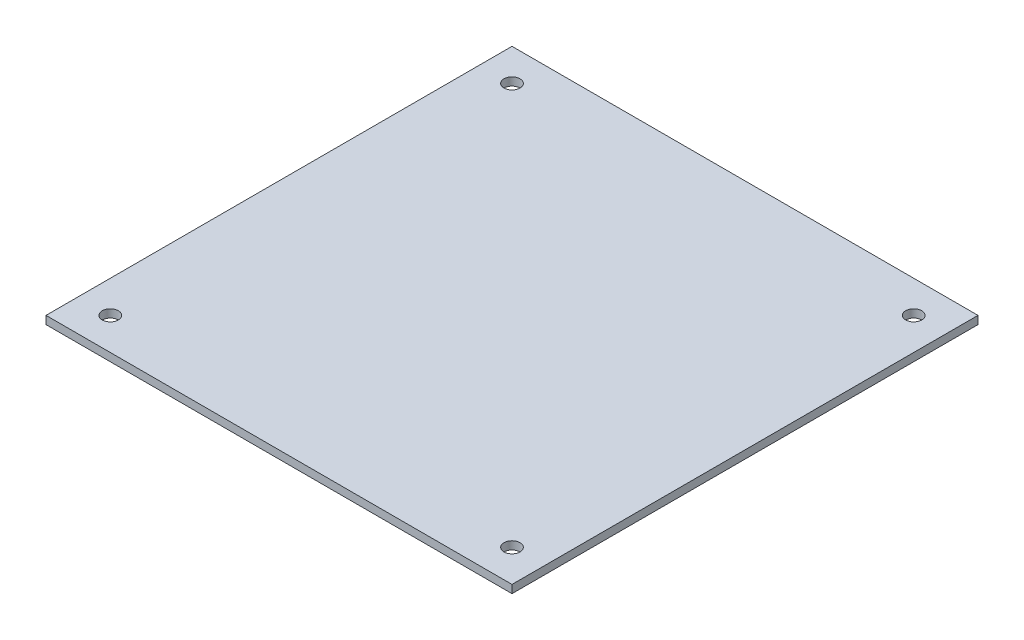
ISO-10303-21;
HEADER;
FILE_DESCRIPTION(('STEP AP214'),'2;1');
FILE_NAME('part.step','',(''),(''),'','','');
FILE_SCHEMA(('AUTOMOTIVE_DESIGN { 1 0 10303 214 1 1 1 1 }'));
ENDSEC;
DATA;
#1=APPLICATION_CONTEXT('core data for automotive mechanical design processes');
#2=APPLICATION_PROTOCOL_DEFINITION('international standard','automotive_design',2000,#1);
#3=PRODUCT_CONTEXT('',#1,'mechanical');
#4=PRODUCT('Part','Part','',(#3));
#5=PRODUCT_RELATED_PRODUCT_CATEGORY('part','',(#4));
#6=PRODUCT_DEFINITION_FORMATION('','',#4);
#7=PRODUCT_DEFINITION_CONTEXT('part definition',#1,'design');
#8=PRODUCT_DEFINITION('design','',#6,#7);
#9=PRODUCT_DEFINITION_SHAPE('','',#8);
#10=(LENGTH_UNIT() NAMED_UNIT(*) SI_UNIT(.MILLI.,.METRE.));
#11=(NAMED_UNIT(*) PLANE_ANGLE_UNIT() SI_UNIT($,.RADIAN.));
#12=(NAMED_UNIT(*) SI_UNIT($,.STERADIAN.) SOLID_ANGLE_UNIT());
#13=UNCERTAINTY_MEASURE_WITH_UNIT(LENGTH_MEASURE(1.E-05),#10,'distance_accuracy_value','');
#14=(GEOMETRIC_REPRESENTATION_CONTEXT(3) GLOBAL_UNCERTAINTY_ASSIGNED_CONTEXT((#13)) GLOBAL_UNIT_ASSIGNED_CONTEXT((#10,
#11,#12)) REPRESENTATION_CONTEXT('',''));
#15=CARTESIAN_POINT('',(0.,0.,0.));
#16=DIRECTION('',(0.,0.,1.));
#17=DIRECTION('',(1.,0.,0.));
#18=AXIS2_PLACEMENT_3D('',#15,#16,#17);
#19=CARTESIAN_POINT('',(0.,2.5,0.));
#20=DIRECTION('',(0.,1.,0.));
#21=DIRECTION('',(0.,0.,1.));
#22=AXIS2_PLACEMENT_3D('',#19,#20,#21);
#23=PLANE('',#22);
#24=CARTESIAN_POINT('',(62.5000000000034,2.5,62.4999999999966));
#25=DIRECTION('',(0.,1.,0.));
#26=DIRECTION('',(0.,0.,1.));
#27=AXIS2_PLACEMENT_3D('',#24,#25,#26);
#28=CIRCLE('',#27,2.49999999999822);
#29=CARTESIAN_POINT('',(62.5000000000034,2.5,64.9999999999948));
#30=VERTEX_POINT('',#29);
#31=EDGE_CURVE('E122',#30,#30,#28,.T.);
#32=ORIENTED_EDGE('',*,*,#31,.F.);
#33=EDGE_LOOP('',(#32));
#34=FACE_BOUND('',#33,.T.);
#35=CARTESIAN_POINT('',(-62.5,2.5,-62.5));
#36=DIRECTION('',(0.,1.,0.));
#37=DIRECTION('',(0.,0.,1.));
#38=AXIS2_PLACEMENT_3D('',#35,#36,#37);
#39=CIRCLE('',#38,2.49999999999822);
#40=CARTESIAN_POINT('',(-62.5,2.5,-60.0000000000018));
#41=VERTEX_POINT('',#40);
#42=EDGE_CURVE('E101',#41,#41,#39,.T.);
#43=ORIENTED_EDGE('',*,*,#42,.F.);
#44=EDGE_LOOP('',(#43));
#45=FACE_BOUND('',#44,.T.);
#46=DIRECTION('',(0.,0.,1.));
#47=VECTOR('',#46,1.);
#48=CARTESIAN_POINT('',(-72.5,2.5,-72.5));
#49=LINE('',#48,#47);
#50=CARTESIAN_POINT('',(-72.5,2.5,-72.5));
#51=VERTEX_POINT('',#50);
#52=CARTESIAN_POINT('',(-72.5,2.5,72.5));
#53=VERTEX_POINT('',#52);
#54=EDGE_CURVE('E86',#51,#53,#49,.T.);
#55=ORIENTED_EDGE('',*,*,#54,.T.);
#56=DIRECTION('',(1.,0.,0.));
#57=VECTOR('',#56,1.);
#58=CARTESIAN_POINT('',(-72.5,2.5,72.5));
#59=LINE('',#58,#57);
#60=CARTESIAN_POINT('',(72.5,2.5,72.5));
#61=VERTEX_POINT('',#60);
#62=EDGE_CURVE('E81',#53,#61,#59,.T.);
#63=ORIENTED_EDGE('',*,*,#62,.T.);
#64=DIRECTION('',(0.,0.,-1.));
#65=VECTOR('',#64,1.);
#66=CARTESIAN_POINT('',(72.5,2.5,-72.5));
#67=LINE('',#66,#65);
#68=CARTESIAN_POINT('',(72.5,2.5,-72.5));
#69=VERTEX_POINT('',#68);
#70=EDGE_CURVE('E84',#61,#69,#67,.T.);
#71=ORIENTED_EDGE('',*,*,#70,.T.);
#72=DIRECTION('',(-1.,0.,0.));
#73=VECTOR('',#72,1.);
#74=CARTESIAN_POINT('',(-72.5,2.5,-72.5));
#75=LINE('',#74,#73);
#76=EDGE_CURVE('E51',#69,#51,#75,.T.);
#77=ORIENTED_EDGE('',*,*,#76,.T.);
#78=EDGE_LOOP('',(#55,#63,#71,#77));
#79=FACE_BOUND('',#78,.T.);
#80=CARTESIAN_POINT('',(62.5,2.5,-62.5000000000034));
#81=DIRECTION('',(0.,1.,0.));
#82=DIRECTION('',(0.,0.,1.));
#83=AXIS2_PLACEMENT_3D('',#80,#81,#82);
#84=CIRCLE('',#83,2.49999999999822);
#85=CARTESIAN_POINT('',(62.5,2.5,-60.0000000000052));
#86=VERTEX_POINT('',#85);
#87=EDGE_CURVE('E116',#86,#86,#84,.T.);
#88=ORIENTED_EDGE('',*,*,#87,.F.);
#89=EDGE_LOOP('',(#88));
#90=FACE_BOUND('',#89,.T.);
#91=CARTESIAN_POINT('',(-62.4999999999966,2.5,62.5));
#92=DIRECTION('',(0.,1.,0.));
#93=DIRECTION('',(0.,0.,1.));
#94=AXIS2_PLACEMENT_3D('',#91,#92,#93);
#95=CIRCLE('',#94,2.49999999999822);
#96=CARTESIAN_POINT('',(-62.4999999999966,2.5,64.9999999999982));
#97=VERTEX_POINT('',#96);
#98=EDGE_CURVE('E128',#97,#97,#95,.T.);
#99=ORIENTED_EDGE('',*,*,#98,.F.);
#100=EDGE_LOOP('',(#99));
#101=FACE_BOUND('',#100,.T.);
#102=ADVANCED_FACE('F34',(#34,#45,#79,#90,#101),#23,.T.);
#103=CARTESIAN_POINT('',(0.,0.,0.));
#104=DIRECTION('',(0.,1.,0.));
#105=DIRECTION('',(0.,0.,1.));
#106=AXIS2_PLACEMENT_3D('',#103,#104,#105);
#107=PLANE('',#106);
#108=CARTESIAN_POINT('',(62.5000000000034,0.,62.4999999999966));
#109=DIRECTION('',(0.,1.,0.));
#110=DIRECTION('',(0.,0.,1.));
#111=AXIS2_PLACEMENT_3D('',#108,#109,#110);
#112=CIRCLE('',#111,2.49999999999822);
#113=CARTESIAN_POINT('',(62.5000000000034,0.,64.9999999999948));
#114=VERTEX_POINT('',#113);
#115=EDGE_CURVE('E125',#114,#114,#112,.T.);
#116=ORIENTED_EDGE('',*,*,#115,.T.);
#117=EDGE_LOOP('',(#116));
#118=FACE_BOUND('',#117,.T.);
#119=CARTESIAN_POINT('',(-62.5,0.,-62.5));
#120=DIRECTION('',(0.,1.,0.));
#121=DIRECTION('',(0.,0.,1.));
#122=AXIS2_PLACEMENT_3D('',#119,#120,#121);
#123=CIRCLE('',#122,2.49999999999822);
#124=CARTESIAN_POINT('',(-62.5,0.,-60.0000000000018));
#125=VERTEX_POINT('',#124);
#126=EDGE_CURVE('E113',#125,#125,#123,.T.);
#127=ORIENTED_EDGE('',*,*,#126,.T.);
#128=EDGE_LOOP('',(#127));
#129=FACE_BOUND('',#128,.T.);
#130=DIRECTION('',(0.,0.,1.));
#131=VECTOR('',#130,1.);
#132=CARTESIAN_POINT('',(-72.5,0.,-72.5));
#133=LINE('',#132,#131);
#134=CARTESIAN_POINT('',(-72.5,0.,-72.5));
#135=VERTEX_POINT('',#134);
#136=CARTESIAN_POINT('',(-72.5,0.,72.5));
#137=VERTEX_POINT('',#136);
#138=EDGE_CURVE('E98',#135,#137,#133,.T.);
#139=ORIENTED_EDGE('',*,*,#138,.F.);
#140=DIRECTION('',(-1.,0.,0.));
#141=VECTOR('',#140,1.);
#142=CARTESIAN_POINT('',(-72.5,0.,-72.5));
#143=LINE('',#142,#141);
#144=CARTESIAN_POINT('',(72.5,0.,-72.5));
#145=VERTEX_POINT('',#144);
#146=EDGE_CURVE('E74',#145,#135,#143,.T.);
#147=ORIENTED_EDGE('',*,*,#146,.F.);
#148=DIRECTION('',(0.,0.,-1.));
#149=VECTOR('',#148,1.);
#150=CARTESIAN_POINT('',(72.5,0.,-72.5));
#151=LINE('',#150,#149);
#152=CARTESIAN_POINT('',(72.5,0.,72.5));
#153=VERTEX_POINT('',#152);
#154=EDGE_CURVE('E68',#153,#145,#151,.T.);
#155=ORIENTED_EDGE('',*,*,#154,.F.);
#156=DIRECTION('',(1.,0.,0.));
#157=VECTOR('',#156,1.);
#158=CARTESIAN_POINT('',(-72.5,0.,72.5));
#159=LINE('',#158,#157);
#160=EDGE_CURVE('E90',#137,#153,#159,.T.);
#161=ORIENTED_EDGE('',*,*,#160,.F.);
#162=EDGE_LOOP('',(#139,#147,#155,#161));
#163=FACE_BOUND('',#162,.T.);
#164=CARTESIAN_POINT('',(62.5,0.,-62.5000000000034));
#165=DIRECTION('',(0.,1.,0.));
#166=DIRECTION('',(0.,0.,1.));
#167=AXIS2_PLACEMENT_3D('',#164,#165,#166);
#168=CIRCLE('',#167,2.49999999999822);
#169=CARTESIAN_POINT('',(62.5,0.,-60.0000000000052));
#170=VERTEX_POINT('',#169);
#171=EDGE_CURVE('E119',#170,#170,#168,.T.);
#172=ORIENTED_EDGE('',*,*,#171,.T.);
#173=EDGE_LOOP('',(#172));
#174=FACE_BOUND('',#173,.T.);
#175=CARTESIAN_POINT('',(-62.4999999999966,0.,62.5));
#176=DIRECTION('',(0.,1.,0.));
#177=DIRECTION('',(0.,0.,1.));
#178=AXIS2_PLACEMENT_3D('',#175,#176,#177);
#179=CIRCLE('',#178,2.49999999999822);
#180=CARTESIAN_POINT('',(-62.4999999999966,0.,64.9999999999982));
#181=VERTEX_POINT('',#180);
#182=EDGE_CURVE('E131',#181,#181,#179,.T.);
#183=ORIENTED_EDGE('',*,*,#182,.T.);
#184=EDGE_LOOP('',(#183));
#185=FACE_BOUND('',#184,.T.);
#186=ADVANCED_FACE('F109',(#118,#129,#163,#174,#185),#107,.F.);
#187=CARTESIAN_POINT('',(-72.5,2.5,-72.5));
#188=DIRECTION('',(1.,0.,0.));
#189=DIRECTION('',(0.,0.,-1.));
#190=AXIS2_PLACEMENT_3D('',#187,#188,#189);
#191=PLANE('',#190);
#192=ORIENTED_EDGE('',*,*,#138,.T.);
#193=DIRECTION('',(0.,-1.,0.));
#194=VECTOR('',#193,1.);
#195=CARTESIAN_POINT('',(-72.5,2.5,72.5));
#196=LINE('',#195,#194);
#197=EDGE_CURVE('E11',#53,#137,#196,.T.);
#198=ORIENTED_EDGE('',*,*,#197,.F.);
#199=ORIENTED_EDGE('',*,*,#54,.F.);
#200=DIRECTION('',(0.,-1.,0.));
#201=VECTOR('',#200,1.);
#202=CARTESIAN_POINT('',(-72.5,2.5,-72.5));
#203=LINE('',#202,#201);
#204=EDGE_CURVE('E94',#51,#135,#203,.T.);
#205=ORIENTED_EDGE('',*,*,#204,.T.);
#206=EDGE_LOOP('',(#192,#198,#199,#205));
#207=FACE_BOUND('',#206,.T.);
#208=ADVANCED_FACE('F36',(#207),#191,.F.);
#209=CARTESIAN_POINT('',(-72.5,2.5,72.5));
#210=DIRECTION('',(0.,0.,-1.));
#211=DIRECTION('',(-1.,0.,0.));
#212=AXIS2_PLACEMENT_3D('',#209,#210,#211);
#213=PLANE('',#212);
#214=ORIENTED_EDGE('',*,*,#160,.T.);
#215=DIRECTION('',(0.,-1.,0.));
#216=VECTOR('',#215,1.);
#217=CARTESIAN_POINT('',(72.5,2.5,72.5));
#218=LINE('',#217,#216);
#219=EDGE_CURVE('E43',#61,#153,#218,.T.);
#220=ORIENTED_EDGE('',*,*,#219,.F.);
#221=ORIENTED_EDGE('',*,*,#62,.F.);
#222=ORIENTED_EDGE('',*,*,#197,.T.);
#223=EDGE_LOOP('',(#214,#220,#221,#222));
#224=FACE_BOUND('',#223,.T.);
#225=ADVANCED_FACE('F89',(#224),#213,.F.);
#226=CARTESIAN_POINT('',(72.5,2.5,-72.5));
#227=DIRECTION('',(-1.,0.,0.));
#228=DIRECTION('',(0.,0.,1.));
#229=AXIS2_PLACEMENT_3D('',#226,#227,#228);
#230=PLANE('',#229);
#231=ORIENTED_EDGE('',*,*,#154,.T.);
#232=DIRECTION('',(0.,-1.,0.));
#233=VECTOR('',#232,1.);
#234=CARTESIAN_POINT('',(72.5,2.5,-72.5));
#235=LINE('',#234,#233);
#236=EDGE_CURVE('E91',#69,#145,#235,.T.);
#237=ORIENTED_EDGE('',*,*,#236,.F.);
#238=ORIENTED_EDGE('',*,*,#70,.F.);
#239=ORIENTED_EDGE('',*,*,#219,.T.);
#240=EDGE_LOOP('',(#231,#237,#238,#239));
#241=FACE_BOUND('',#240,.T.);
#242=ADVANCED_FACE('F92',(#241),#230,.F.);
#243=CARTESIAN_POINT('',(-72.5,2.5,-72.5));
#244=DIRECTION('',(0.,0.,1.));
#245=DIRECTION('',(1.,0.,0.));
#246=AXIS2_PLACEMENT_3D('',#243,#244,#245);
#247=PLANE('',#246);
#248=ORIENTED_EDGE('',*,*,#146,.T.);
#249=ORIENTED_EDGE('',*,*,#204,.F.);
#250=ORIENTED_EDGE('',*,*,#76,.F.);
#251=ORIENTED_EDGE('',*,*,#236,.T.);
#252=EDGE_LOOP('',(#248,#249,#250,#251));
#253=FACE_BOUND('',#252,.T.);
#254=ADVANCED_FACE('F106',(#253),#247,.F.);
#255=CARTESIAN_POINT('',(-62.5,2.5,-62.5));
#256=DIRECTION('',(0.,-1.,0.));
#257=DIRECTION('',(0.,0.,-1.));
#258=AXIS2_PLACEMENT_3D('',#255,#256,#257);
#259=CYLINDRICAL_SURFACE('',#258,2.49999999999822);
#260=ORIENTED_EDGE('',*,*,#42,.T.);
#261=EDGE_LOOP('',(#260));
#262=FACE_BOUND('',#261,.T.);
#263=ORIENTED_EDGE('',*,*,#126,.F.);
#264=EDGE_LOOP('',(#263));
#265=FACE_BOUND('',#264,.T.);
#266=ADVANCED_FACE('F151',(#262,#265),#259,.F.);
#267=CARTESIAN_POINT('',(62.5,2.5,-62.5000000000034));
#268=DIRECTION('',(0.,-1.,0.));
#269=DIRECTION('',(0.,0.,-1.));
#270=AXIS2_PLACEMENT_3D('',#267,#268,#269);
#271=CYLINDRICAL_SURFACE('',#270,2.49999999999822);
#272=ORIENTED_EDGE('',*,*,#87,.T.);
#273=EDGE_LOOP('',(#272));
#274=FACE_BOUND('',#273,.T.);
#275=ORIENTED_EDGE('',*,*,#171,.F.);
#276=EDGE_LOOP('',(#275));
#277=FACE_BOUND('',#276,.T.);
#278=ADVANCED_FACE('F197',(#274,#277),#271,.F.);
#279=CARTESIAN_POINT('',(62.5000000000034,2.5,62.4999999999966));
#280=DIRECTION('',(0.,-1.,0.));
#281=DIRECTION('',(0.,0.,-1.));
#282=AXIS2_PLACEMENT_3D('',#279,#280,#281);
#283=CYLINDRICAL_SURFACE('',#282,2.49999999999822);
#284=ORIENTED_EDGE('',*,*,#31,.T.);
#285=EDGE_LOOP('',(#284));
#286=FACE_BOUND('',#285,.T.);
#287=ORIENTED_EDGE('',*,*,#115,.F.);
#288=EDGE_LOOP('',(#287));
#289=FACE_BOUND('',#288,.T.);
#290=ADVANCED_FACE('F205',(#286,#289),#283,.F.);
#291=CARTESIAN_POINT('',(-62.4999999999966,2.5,62.5));
#292=DIRECTION('',(0.,-1.,0.));
#293=DIRECTION('',(0.,0.,-1.));
#294=AXIS2_PLACEMENT_3D('',#291,#292,#293);
#295=CYLINDRICAL_SURFACE('',#294,2.49999999999822);
#296=ORIENTED_EDGE('',*,*,#98,.T.);
#297=EDGE_LOOP('',(#296));
#298=FACE_BOUND('',#297,.T.);
#299=ORIENTED_EDGE('',*,*,#182,.F.);
#300=EDGE_LOOP('',(#299));
#301=FACE_BOUND('',#300,.T.);
#302=ADVANCED_FACE('F137',(#298,#301),#295,.F.);
#303=CLOSED_SHELL('',(#102,#186,#208,#225,#242,#254,#266,#278,#290,#302));
#304=MANIFOLD_SOLID_BREP('B2',#303);
#305=ADVANCED_BREP_SHAPE_REPRESENTATION('',(#18,#304),#14);
#306=SHAPE_DEFINITION_REPRESENTATION(#9,#305);
ENDSEC;
END-ISO-10303-21;
